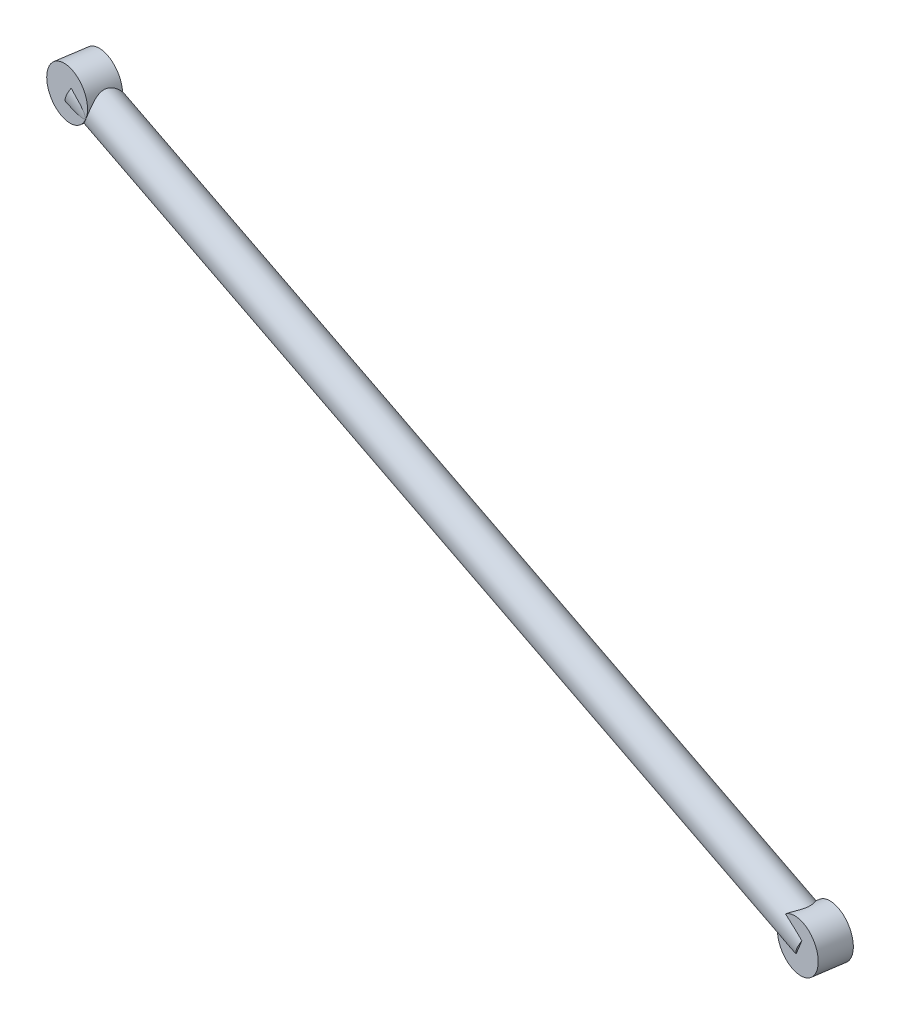
ISO-10303-21;
HEADER;
FILE_DESCRIPTION(('STEP AP214'),'2;1');
FILE_NAME('part.step','',(''),(''),'','','');
FILE_SCHEMA(('AUTOMOTIVE_DESIGN { 1 0 10303 214 1 1 1 1 }'));
ENDSEC;
DATA;
#1=APPLICATION_CONTEXT('core data for automotive mechanical design processes');
#2=APPLICATION_PROTOCOL_DEFINITION('international standard','automotive_design',2000,#1);
#3=PRODUCT_CONTEXT('',#1,'mechanical');
#4=PRODUCT('Part','Part','',(#3));
#5=PRODUCT_RELATED_PRODUCT_CATEGORY('part','',(#4));
#6=PRODUCT_DEFINITION_FORMATION('','',#4);
#7=PRODUCT_DEFINITION_CONTEXT('part definition',#1,'design');
#8=PRODUCT_DEFINITION('design','',#6,#7);
#9=PRODUCT_DEFINITION_SHAPE('','',#8);
#10=(LENGTH_UNIT() NAMED_UNIT(*) SI_UNIT(.MILLI.,.METRE.));
#11=(NAMED_UNIT(*) PLANE_ANGLE_UNIT() SI_UNIT($,.RADIAN.));
#12=(NAMED_UNIT(*) SI_UNIT($,.STERADIAN.) SOLID_ANGLE_UNIT());
#13=UNCERTAINTY_MEASURE_WITH_UNIT(LENGTH_MEASURE(1.E-05),#10,'distance_accuracy_value','');
#14=(GEOMETRIC_REPRESENTATION_CONTEXT(3) GLOBAL_UNCERTAINTY_ASSIGNED_CONTEXT((#13)) GLOBAL_UNIT_ASSIGNED_CONTEXT((#10,
#11,#12)) REPRESENTATION_CONTEXT('',''));
#15=CARTESIAN_POINT('',(0.,0.,0.));
#16=DIRECTION('',(0.,0.,1.));
#17=DIRECTION('',(1.,0.,0.));
#18=AXIS2_PLACEMENT_3D('',#15,#16,#17);
#19=CARTESIAN_POINT('',(-175.,1319.6,-94.));
#20=DIRECTION('',(-0.912250150157576,0.407836306683906,-0.0383302816048973));
#21=DIRECTION('',(-0.408136235908337,-0.912921033243607,0.));
#22=AXIS2_PLACEMENT_3D('',#19,#20,#21);
#23=PLANE('',#22);
#24=DIRECTION('',(-0.405264883425802,-0.9121907599121,-0.060567250167539));
#25=VECTOR('',#24,1.);
#26=CARTESIAN_POINT('',(-175.419638353964,1319.32065466055,-86.9849724910181));
#27=LINE('',#26,#25);
#28=CARTESIAN_POINT('',(-173.874560531103,1322.79839421066,-86.7540590345291));
#29=VERTEX_POINT('',#28);
#30=CARTESIAN_POINT('',(-176.964716176824,1315.84291511045,-87.2158859475072));
#31=VERTEX_POINT('',#30);
#32=EDGE_CURVE('E214',#29,#31,#27,.T.);
#33=ORIENTED_EDGE('',*,*,#32,.F.);
#34=CARTESIAN_POINT('',(-175.,1319.6,-94.));
#35=DIRECTION('',(-0.912250150157576,0.407836306683906,-0.0383302816048973));
#36=DIRECTION('',(-0.408136235908337,-0.912921033243607,0.));
#37=AXIS2_PLACEMENT_3D('',#34,#35,#36);
#38=CIRCLE('',#37,8.00000000000001);
#39=EDGE_CURVE('E121',#31,#29,#38,.T.);
#40=ORIENTED_EDGE('',*,*,#39,.F.);
#41=EDGE_LOOP('',(#33,#40));
#42=FACE_BOUND('',#41,.T.);
#43=ADVANCED_FACE('F61',(#42),#23,.F.);
#44=CARTESIAN_POINT('',(-175.,1319.6,-94.));
#45=DIRECTION('',(-0.912250150157576,0.407836306683905,-0.0383302816048975));
#46=DIRECTION('',(-0.408136235908336,-0.912921033243607,0.));
#47=AXIS2_PLACEMENT_3D('',#44,#45,#46);
#48=CYLINDRICAL_SURFACE('',#47,8.00000000000001);
#49=CARTESIAN_POINT('',(-454.929916770915,1444.74723441423,-105.761897257689));
#50=DIRECTION('',(0.147809429099499,0.,-0.989015860676299));
#51=DIRECTION('',(-0.902171129515433,0.409765808152639,-0.134830395452446));
#52=AXIS2_PLACEMENT_3D('',#49,#50,#51);
#53=ELLIPSE('',#52,82.5338575678715,8.00000000000001);
#54=CARTESIAN_POINT('',(-508.92760737851,1475.03577829605,-113.831907192557));
#55=VERTEX_POINT('',#54);
#56=CARTESIAN_POINT('',(-518.845283823176,1477.95708488955,-115.314114052493));
#57=VERTEX_POINT('',#56);
#58=EDGE_CURVE('E82',#55,#57,#53,.F.);
#59=ORIENTED_EDGE('',*,*,#58,.F.);
#60=CARTESIAN_POINT('',(-513.188387094106,1465.44539915011,-114.468685066726));
#61=CARTESIAN_POINT('',(-513.284215606307,1465.38148107877,-114.395912880529));
#62=CARTESIAN_POINT('',(-513.379969312568,1465.31975148933,-114.321160369834));
#63=CARTESIAN_POINT('',(-513.571010630116,1465.20054398279,-114.16779086904));
#64=CARTESIAN_POINT('',(-513.666298283711,1465.14306567281,-114.089174237157));
#65=CARTESIAN_POINT('',(-513.951052462724,1464.97678027019,-113.847619125337));
#66=CARTESIAN_POINT('',(-514.139371274944,1464.87414840124,-113.679004876877));
#67=CARTESIAN_POINT('',(-514.512077511583,1464.6834506392,-113.325382032472));
#68=CARTESIAN_POINT('',(-514.696402404782,1464.59555004078,-113.140219089599));
#69=CARTESIAN_POINT('',(-515.055944497999,1464.43470311508,-112.755175302953));
#70=CARTESIAN_POINT('',(-515.231164218723,1464.36175263233,-112.555298570024));
#71=CARTESIAN_POINT('',(-515.528515289075,1464.24571192585,-112.190185128124));
#72=CARTESIAN_POINT('',(-515.653333777297,1464.19965084251,-112.028071224825));
#73=CARTESIAN_POINT('',(-515.893689532046,1464.11539998663,-111.69504976594));
#74=CARTESIAN_POINT('',(-516.00922494514,1464.0772117836,-111.524140465407));
#75=CARTESIAN_POINT('',(-516.228316651389,1464.00862880188,-111.174197400632));
#76=CARTESIAN_POINT('',(-516.33191632106,1463.97820528114,-110.995196573874));
#77=CARTESIAN_POINT('',(-516.525062279776,1463.92484143448,-110.628716238182));
#78=CARTESIAN_POINT('',(-516.614614534461,1463.90189792746,-110.44124037223));
#79=CARTESIAN_POINT('',(-516.758935008781,1463.86772008986,-110.100942443538));
#80=CARTESIAN_POINT('',(-516.817011585485,1463.85501700718,-109.949668800854));
#81=CARTESIAN_POINT('',(-516.921759004663,1463.83414132443,-109.642973426285));
#82=CARTESIAN_POINT('',(-516.96843563464,1463.82596642282,-109.487553843842));
#83=CARTESIAN_POINT('',(-517.049296469572,1463.81419922874,-109.173447573947));
#84=CARTESIAN_POINT('',(-517.083490873184,1463.81060318909,-109.014763666125));
#85=CARTESIAN_POINT('',(-517.138672616055,1463.80805912332,-108.695066831906));
#86=CARTESIAN_POINT('',(-517.159659857481,1463.80911113163,-108.534053888265));
#87=CARTESIAN_POINT('',(-517.188120954294,1463.81595848405,-108.210668996741));
#88=CARTESIAN_POINT('',(-517.195572392196,1463.82176167388,-108.048295241007));
#89=CARTESIAN_POINT('',(-517.197062333499,1463.83821438644,-107.723742926205));
#90=CARTESIAN_POINT('',(-517.191100880022,1463.84886389359,-107.561564366509));
#91=CARTESIAN_POINT('',(-517.166379034688,1463.87511820729,-107.238413695151));
#92=CARTESIAN_POINT('',(-517.147603725284,1463.89072877805,-107.077443210957));
#93=CARTESIAN_POINT('',(-517.098205941933,1463.92700542713,-106.757838793334));
#94=CARTESIAN_POINT('',(-517.067576470344,1463.94767448887,-106.599206297569));
#95=CARTESIAN_POINT('',(-516.985670444903,1464.00061605199,-106.241612685622));
#96=CARTESIAN_POINT('',(-516.931024082251,1464.03451681949,-106.043661788237));
#97=CARTESIAN_POINT('',(-516.806916875375,1464.11097267185,-105.654161292006));
#98=CARTESIAN_POINT('',(-516.737450070902,1464.15353123825,-105.462614304537));
#99=CARTESIAN_POINT('',(-516.586134263684,1464.247615516,-105.086524202289));
#100=CARTESIAN_POINT('',(-516.504271612527,1464.29915112101,-104.901989091592));
#101=CARTESIAN_POINT('',(-516.330486249463,1464.41144878248,-104.54067003));
#102=CARTESIAN_POINT('',(-516.23856414249,1464.47221028422,-104.363885613904));
#103=CARTESIAN_POINT('',(-516.044272310111,1464.60489195043,-104.014197024769));
#104=CARTESIAN_POINT('',(-515.941701241295,1464.67704979184,-103.841495202773));
#105=CARTESIAN_POINT('',(-515.729889661392,1464.83176291237,-103.504976357548));
#106=CARTESIAN_POINT('',(-515.620646608379,1464.91432216716,-103.341162766051));
#107=CARTESIAN_POINT('',(-515.397175988386,1465.09015090664,-103.022963086213));
#108=CARTESIAN_POINT('',(-515.282948653722,1465.18341989248,-102.86857655928));
#109=CARTESIAN_POINT('',(-515.051005336409,1465.38096791528,-102.569789444029));
#110=CARTESIAN_POINT('',(-514.93328929424,1465.48524714016,-102.425389026221));
#111=CARTESIAN_POINT('',(-514.673816757727,1465.72537779699,-102.121536100618));
#112=CARTESIAN_POINT('',(-514.53163573525,1465.86350323625,-101.9642294971));
#113=CARTESIAN_POINT('',(-514.246586298299,1466.15578537282,-101.665887338322));
#114=CARTESIAN_POINT('',(-514.103717796108,1466.30994417056,-101.524853920028));
#115=CARTESIAN_POINT('',(-513.819610749535,1466.63413059401,-101.260659654245));
#116=CARTESIAN_POINT('',(-513.678371484734,1466.80415087813,-101.13749060492));
#117=CARTESIAN_POINT('',(-513.399733089623,1467.15962294355,-100.910610403272));
#118=CARTESIAN_POINT('',(-513.262333222813,1467.34507173771,-100.806895497008));
#119=CARTESIAN_POINT('',(-513.007457538217,1467.71057423264,-100.630143130501));
#120=CARTESIAN_POINT('',(-512.889386735631,1467.88921809355,-100.55504674225));
#121=CARTESIAN_POINT('',(-512.659716084986,1468.25704697323,-100.422891302543));
#122=CARTESIAN_POINT('',(-512.548115854032,1468.44623136695,-100.365831182899));
#123=CARTESIAN_POINT('',(-512.332961898018,1468.83348831759,-100.270674387989));
#124=CARTESIAN_POINT('',(-512.229400585659,1469.03155220826,-100.232559643438));
#125=CARTESIAN_POINT('',(-512.031490666457,1469.43493033538,-100.175803793474));
#126=CARTESIAN_POINT('',(-511.937140925115,1469.64024367474,-100.157160287231));
#127=CARTESIAN_POINT('',(-511.771065092662,1470.02715238659,-100.140789140383));
#128=CARTESIAN_POINT('',(-511.698017072297,1470.20807930168,-100.140515162502));
#129=CARTESIAN_POINT('',(-511.559928086673,1470.57241143728,-100.154485389974));
#130=CARTESIAN_POINT('',(-511.494886990289,1470.75581661714,-100.168729357541));
#131=CARTESIAN_POINT('',(-511.373068215277,1471.12369301274,-100.211468599641));
#132=CARTESIAN_POINT('',(-511.316290417062,1471.308164213,-100.239963667906));
#133=CARTESIAN_POINT('',(-511.211047521104,1471.676820357,-100.31077102855));
#134=CARTESIAN_POINT('',(-511.162582757686,1471.86100528893,-100.353083876439));
#135=CARTESIAN_POINT('',(-511.073930236069,1472.22742975323,-100.450872194918));
#136=CARTESIAN_POINT('',(-511.033725577281,1472.40967251967,-100.506320279098));
#137=CARTESIAN_POINT('',(-510.961162752602,1472.77146253857,-100.629796910271));
#138=CARTESIAN_POINT('',(-510.928807191894,1472.95100887755,-100.69782962104));
#139=CARTESIAN_POINT('',(-510.842935488211,1473.4838350479,-100.919757151377));
#140=CARTESIAN_POINT('',(-510.800544231177,1473.83160025075,-101.091562088993));
#141=CARTESIAN_POINT('',(-510.737208236331,1474.54621816025,-101.50138807176));
#142=CARTESIAN_POINT('',(-510.71953561003,1474.91017218083,-101.744949079911));
#143=CARTESIAN_POINT('',(-510.710142882917,1475.42882939972,-102.145972958755));
#144=CARTESIAN_POINT('',(-510.709876047381,1475.59738066856,-102.285809815468));
#145=CARTESIAN_POINT('',(-510.713763553988,1475.92428141629,-102.57685627291));
#146=CARTESIAN_POINT('',(-510.717916665044,1476.08263372286,-102.728062695974));
#147=CARTESIAN_POINT('',(-510.730034917516,1476.40980863138,-103.063737689257));
#148=CARTESIAN_POINT('',(-510.738459066905,1476.57690602365,-103.249875201733));
#149=CARTESIAN_POINT('',(-510.756833177872,1476.8944675556,-103.635892305335));
#150=CARTESIAN_POINT('',(-510.76678356591,1477.04492702602,-103.835775728704));
#151=CARTESIAN_POINT('',(-510.785446734009,1477.32651050548,-104.248180838236));
#152=CARTESIAN_POINT('',(-510.794162219972,1477.4576768143,-104.460673397874));
#153=CARTESIAN_POINT('',(-510.807311163272,1477.69819463725,-104.897752933377));
#154=CARTESIAN_POINT('',(-510.811747557483,1477.80756107236,-105.122331502311));
#155=CARTESIAN_POINT('',(-510.812874951089,1477.96784841007,-105.502629823565));
#156=CARTESIAN_POINT('',(-510.811711190807,1478.02591160208,-105.655354782394));
#157=CARTESIAN_POINT('',(-510.805297289807,1478.13041213384,-105.964631316349));
#158=CARTESIAN_POINT('',(-510.800048438265,1478.17685313523,-106.121181669161));
#159=CARTESIAN_POINT('',(-510.784729494624,1478.25722156708,-106.436973815161));
#160=CARTESIAN_POINT('',(-510.774667296967,1478.29116932717,-106.596210790883));
#161=CARTESIAN_POINT('',(-510.749193773776,1478.3460243815,-106.916509267967));
#162=CARTESIAN_POINT('',(-510.733782369688,1478.36693148423,-107.077570796089));
#163=CARTESIAN_POINT('',(-510.697320633757,1478.39541635289,-107.400735499338));
#164=CARTESIAN_POINT('',(-510.676253350494,1478.4029535221,-107.562840352047));
#165=CARTESIAN_POINT('',(-510.62860774187,1478.40461580282,-107.886296337631));
#166=CARTESIAN_POINT('',(-510.602029502998,1478.39874112482,-108.047647482294));
#167=CARTESIAN_POINT('',(-510.543770021585,1478.37397883237,-108.368527043822));
#168=CARTESIAN_POINT('',(-510.512085032706,1478.35508163094,-108.528054029752));
#169=CARTESIAN_POINT('',(-510.444296138434,1478.30495383166,-108.844262575362));
#170=CARTESIAN_POINT('',(-510.408189938072,1478.27371680955,-109.00094260837));
#171=CARTESIAN_POINT('',(-510.321935549513,1478.18955933853,-109.353466578559));
#172=CARTESIAN_POINT('',(-510.270663162029,1478.13303305025,-109.548176756109));
#173=CARTESIAN_POINT('',(-510.164173092254,1478.0032228523,-109.930832028154));
#174=CARTESIAN_POINT('',(-510.108953665136,1477.92993149956,-110.118774074832));
#175=CARTESIAN_POINT('',(-509.996185324146,1477.76807453547,-110.48824998895));
#176=CARTESIAN_POINT('',(-509.938627294602,1477.67944365181,-110.66975230566));
#177=CARTESIAN_POINT('',(-509.823143403852,1477.48874787494,-111.025333072067));
#178=CARTESIAN_POINT('',(-509.765217612857,1477.3866854767,-111.199412892604));
#179=CARTESIAN_POINT('',(-509.62912200851,1477.1300330242,-111.60388459156));
#180=CARTESIAN_POINT('',(-509.551465625743,1476.97005543746,-111.831044365497));
#181=CARTESIAN_POINT('',(-509.401918580511,1476.62978986892,-112.271687336442));
#182=CARTESIAN_POINT('',(-509.330030127833,1476.44949416594,-112.48516528548));
#183=CARTESIAN_POINT('',(-509.196055243822,1476.07281359108,-112.895770196044));
#184=CARTESIAN_POINT('',(-509.133860975276,1475.87664918153,-113.093063413306));
#185=CARTESIAN_POINT('',(-509.049382410077,1475.57022165066,-113.378304964837));
#186=CARTESIAN_POINT('',(-509.022695773459,1475.46606916607,-113.471586340123));
#187=CARTESIAN_POINT('',(-508.972602652675,1475.25383286638,-113.654506516911));
#188=CARTESIAN_POINT('',(-508.949196498202,1475.1457486575,-113.74414495165));
#189=CARTESIAN_POINT('',(-508.92760737851,1475.03577829605,-113.831907192557));
#190=B_SPLINE_CURVE_WITH_KNOTS('',3,(#60,#61,#62,#63,#64,#65,#66,#67,#68,#69,#70,#71,#72,#73,
#74,#75,#76,#77,#78,#79,#80,#81,#82,#83,#84,#85,#86,#87,#88,#89,#90,#91,#92,#93,#94,#95,#96,#97,
#98,#99,#100,#101,#102,#103,#104,#105,#106,#107,#108,#109,#110,#111,#112,#113,#114,#115,#116,
#117,#118,#119,#120,#121,#122,#123,#124,#125,#126,#127,#128,#129,#130,#131,#132,#133,#134,#135,
#136,#137,#138,#139,#140,#141,#142,#143,#144,#145,#146,#147,#148,#149,#150,#151,#152,#153,#154,
#155,#156,#157,#158,#159,#160,#161,#162,#163,#164,#165,#166,#167,#168,#169,#170,#171,#172,#173,
#174,#175,#176,#177,#178,#179,#180,#181,#182,#183,#184,#185,#186,#187,#188,#189),.UNSPECIFIED.,
.F.,.F.,(4,2,2,2,2,2,2,2,2,2,2,2,2,2,2,2,2,2,2,2,2,2,2,2,2,2,2,2,2,2,2,2,2,2,2,2,2,2,2,2,2,2,2,
2,2,2,2,2,2,2,2,2,2,2,2,2,2,2,2,2,2,2,2,2,4),(0.,0.408682242264147,0.817326669733494,
1.63478049720184,2.46086825513319,3.28672608429604,3.9154127295844,4.54422458639344,
5.17067389800357,5.79685644532708,6.28400064584833,6.77089701742606,7.25739467301158,
7.74389593226014,8.23120218440849,8.7185068698907,9.20637983228154,9.69454123174017,
10.3180211431972,10.9417522700552,11.5661752162143,12.1905606327649,12.8303016713007,
13.4702879805195,14.1102444918358,14.750211927508,15.5083802863279,16.266648093455,
17.0245666573347,17.7823388197515,18.462104159357,19.1418292327186,19.8209047635675,
20.4998965535663,21.084541147031,21.6691761649017,22.2538027210984,22.8384527836683,
23.4218944408864,24.0055294832903,25.1718591096599,26.4813856612196,27.1379421726908,
27.7943158612191,28.5442547071668,29.2944034839997,30.0428822459092,30.7908469372591,
31.2805847842231,31.7701681420373,32.2589512655465,32.7477415672176,33.2380135170272,
33.7282777731724,34.2189033406527,34.7097846711699,35.336229481197,35.9629529507336,
36.5924119223243,37.2217541329401,38.0859859476789,38.9505472979779,39.8046734058599,
40.2315802031329,40.6585298744859),.UNSPECIFIED.);
#191=CARTESIAN_POINT('',(-513.188387094106,1465.44539915011,-114.468685066726));
#192=VERTEX_POINT('',#191);
#193=EDGE_CURVE('E12',#192,#55,#190,.T.);
#194=ORIENTED_EDGE('',*,*,#193,.F.);
#195=CARTESIAN_POINT('',(-521.935439468897,1471.00160578934,-115.775940965471));
#196=VERTEX_POINT('',#195);
#197=EDGE_CURVE('E123',#196,#192,#53,.F.);
#198=ORIENTED_EDGE('',*,*,#197,.F.);
#199=CARTESIAN_POINT('',(-520.81,1474.2,-108.53));
#200=DIRECTION('',(-0.912250150157576,0.407836306683906,-0.0383302816048973));
#201=DIRECTION('',(-0.408136235908337,-0.912921033243607,0.));
#202=AXIS2_PLACEMENT_3D('',#199,#200,#201);
#203=CIRCLE('',#202,8.00000000000001);
#204=EDGE_CURVE('E116',#57,#196,#203,.T.);
#205=ORIENTED_EDGE('',*,*,#204,.F.);
#206=EDGE_LOOP('',(#59,#194,#198,#205));
#207=FACE_BOUND('',#206,.T.);
#208=CARTESIAN_POINT('',(-186.88239262149,1318.76422170395,-88.698092807443));
#209=CARTESIAN_POINT('',(-186.86172760947,1318.65895795582,-88.7820982554029));
#210=CARTESIAN_POINT('',(-186.839397542882,1318.55542189208,-88.8678240039344));
#211=CARTESIAN_POINT('',(-186.791717181888,1318.35194528448,-89.0426189459024));
#212=CARTESIAN_POINT('',(-186.76636716713,1318.25200440883,-89.1316878292408));
#213=CARTESIAN_POINT('',(-186.686234914089,1317.95771639938,-89.4038238965958));
#214=CARTESIAN_POINT('',(-186.627379057128,1317.76894648059,-89.5917865157624));
#215=CARTESIAN_POINT('',(-186.500733060272,1317.40579937156,-89.9821833139655));
#216=CARTESIAN_POINT('',(-186.432855122353,1317.23159525533,-90.1847493730721));
#217=CARTESIAN_POINT('',(-186.291436170281,1316.9014795489,-90.6023918856319));
#218=CARTESIAN_POINT('',(-186.217896737616,1316.74556288075,-90.8174648413173));
#219=CARTESIAN_POINT('',(-186.086090933412,1316.48898590357,-91.2073191920871));
#220=CARTESIAN_POINT('',(-186.028369924087,1316.38402057736,-91.3794608820408));
#221=CARTESIAN_POINT('',(-185.912909029511,1316.18715174568,-91.7311480051624));
#222=CARTESIAN_POINT('',(-185.855169142789,1316.0952508458,-91.9106949060586));
#223=CARTESIAN_POINT('',(-185.741572625556,1315.926379904,-92.2764043344297));
#224=CARTESIAN_POINT('',(-185.685709734423,1315.84935506178,-92.4625394714276));
#225=CARTESIAN_POINT('',(-185.57747209892,1315.7116029469,-92.8417094426237));
#226=CARTESIAN_POINT('',(-185.525095879305,1315.65086874814,-93.0347413049336));
#227=CARTESIAN_POINT('',(-185.436745580047,1315.55906607617,-93.3834040333743));
#228=CARTESIAN_POINT('',(-185.399711817614,1315.52440492492,-93.5378225461127));
#229=CARTESIAN_POINT('',(-185.329750196278,1315.4669829691,-93.8497166936487));
#230=CARTESIAN_POINT('',(-185.296820258128,1315.44421611934,-94.0071907332052));
#231=CARTESIAN_POINT('',(-185.235800729498,1315.41132349458,-94.3242623065639));
#232=CARTESIAN_POINT('',(-185.207707197373,1315.40118738317,-94.4838579958519));
#233=CARTESIAN_POINT('',(-185.156838070827,1315.39402439333,-94.8041993549798));
#234=CARTESIAN_POINT('',(-185.134062515799,1315.396997612,-94.9649450333293));
#235=CARTESIAN_POINT('',(-185.094012187055,1315.41623589077,-95.2865979023208));
#236=CARTESIAN_POINT('',(-185.076746577603,1315.43252293616,-95.4475049201063));
#237=CARTESIAN_POINT('',(-185.047648831173,1315.47821127201,-95.7679312202748));
#238=CARTESIAN_POINT('',(-185.035816676726,1315.5076125203,-95.9274505071178));
#239=CARTESIAN_POINT('',(-185.017142607838,1315.57903593194,-96.2441156148345));
#240=CARTESIAN_POINT('',(-185.010306528923,1315.62107277334,-96.4012584509228));
#241=CARTESIAN_POINT('',(-185.000966864054,1315.71700535265,-96.712084497002));
#242=CARTESIAN_POINT('',(-184.998465841918,1315.77090808699,-96.8657656066887));
#243=CARTESIAN_POINT('',(-184.996769853746,1315.90614217749,-97.2108648124338));
#244=CARTESIAN_POINT('',(-184.998683506258,1315.99093486926,-97.400934752505));
#245=CARTESIAN_POINT('',(-185.00637465602,1316.17651418439,-97.7730367502648));
#246=CARTESIAN_POINT('',(-185.012153709797,1316.27730723832,-97.9550655384352));
#247=CARTESIAN_POINT('',(-185.025740623204,1316.49323014216,-98.3105719170306));
#248=CARTESIAN_POINT('',(-185.033550725999,1316.60837576991,-98.4840397988465));
#249=CARTESIAN_POINT('',(-185.049485339115,1316.85137658466,-98.8217679048632));
#250=CARTESIAN_POINT('',(-185.057609830512,1316.97923100736,-98.9860286818441));
#251=CARTESIAN_POINT('',(-185.072814849116,1317.24964702721,-99.3089525640053));
#252=CARTESIAN_POINT('',(-185.079864788036,1317.39249299104,-99.4673786557136));
#253=CARTESIAN_POINT('',(-185.091192077072,1317.68904008356,-99.7739349191901));
#254=CARTESIAN_POINT('',(-185.095468363168,1317.84274535302,-99.9220611203129));
#255=CARTESIAN_POINT('',(-185.099912259113,1318.15991307591,-100.207527032851));
#256=CARTESIAN_POINT('',(-185.100080060255,1318.32337507471,-100.344867246167));
#257=CARTESIAN_POINT('',(-185.095108220555,1318.65908770672,-100.608247149567));
#258=CARTESIAN_POINT('',(-185.089968489114,1318.83133848992,-100.734286646706));
#259=CARTESIAN_POINT('',(-185.071750601691,1319.21624752735,-100.996638455228));
#260=CARTESIAN_POINT('',(-185.057381565984,1319.4304929013,-101.130548492881));
#261=CARTESIAN_POINT('',(-185.018051028577,1319.86834166778,-101.380411733649));
#262=CARTESIAN_POINT('',(-184.993088137719,1320.0919462841,-101.496362579077));
#263=CARTESIAN_POINT('',(-184.931212456725,1320.5465153366,-101.708849373348));
#264=CARTESIAN_POINT('',(-184.894305175773,1320.77747633556,-101.805394239714));
#265=CARTESIAN_POINT('',(-184.807457705149,1321.24465839893,-101.977652205961));
#266=CARTESIAN_POINT('',(-184.757520034324,1321.48087843868,-102.053369326155));
#267=CARTESIAN_POINT('',(-184.649760188196,1321.93161439388,-102.175925442734));
#268=CARTESIAN_POINT('',(-184.59327885759,1322.1458613299,-102.224934836649));
#269=CARTESIAN_POINT('',(-184.469062610244,1322.57457903397,-102.304201518514));
#270=CARTESIAN_POINT('',(-184.401328360314,1322.78904978799,-102.334459917082));
#271=CARTESIAN_POINT('',(-184.254815877377,1323.21585000656,-102.375565293819));
#272=CARTESIAN_POINT('',(-184.176048259809,1323.42818132147,-102.38643079383));
#273=CARTESIAN_POINT('',(-184.007921893627,1323.8486962356,-102.388482147614));
#274=CARTESIAN_POINT('',(-183.918564452267,1324.05688034308,-102.379670428035));
#275=CARTESIAN_POINT('',(-183.743220174416,1324.43845733676,-102.345015991175));
#276=CARTESIAN_POINT('',(-183.658490266348,1324.61266498754,-102.321709896731));
#277=CARTESIAN_POINT('',(-183.482533912473,1324.95520203454,-102.260805272968));
#278=CARTESIAN_POINT('',(-183.391307573093,1325.123531527,-102.223206977745));
#279=CARTESIAN_POINT('',(-183.203217274847,1325.45321419611,-102.134151508562));
#280=CARTESIAN_POINT('',(-183.106353397595,1325.61456747369,-102.082694535196));
#281=CARTESIAN_POINT('',(-182.907933447304,1325.92941106975,-101.966504452467));
#282=CARTESIAN_POINT('',(-182.806377185761,1326.08290107182,-101.901770809388));
#283=CARTESIAN_POINT('',(-182.599791001874,1326.38101486421,-101.75985876525));
#284=CARTESIAN_POINT('',(-182.494768693044,1326.52565632428,-101.682706362638));
#285=CARTESIAN_POINT('',(-182.282065536339,1326.80595744867,-101.516596439598));
#286=CARTESIAN_POINT('',(-182.174383818815,1326.94161412005,-101.42763501477));
#287=CARTESIAN_POINT('',(-181.848994052145,1327.33447613169,-101.144244038233));
#288=CARTESIAN_POINT('',(-181.628771930294,1327.57781444519,-100.933191263297));
#289=CARTESIAN_POINT('',(-181.163064061793,1328.05399530329,-100.444299135568));
#290=CARTESIAN_POINT('',(-180.917796155837,1328.28188117248,-100.161441396691));
#291=CARTESIAN_POINT('',(-180.560317212827,1328.58899732119,-99.7055881725657));
#292=CARTESIAN_POINT('',(-180.442741518509,1328.68569199705,-99.5481396295764));
#293=CARTESIAN_POINT('',(-180.212722295674,1328.86777998855,-99.2232975565063));
#294=CARTESIAN_POINT('',(-180.100277347183,1328.95317644363,-99.0559068078879));
#295=CARTESIAN_POINT('',(-179.866719189222,1329.1244297087,-98.6871373948782));
#296=CARTESIAN_POINT('',(-179.746655224511,1329.20861687658,-98.4843151981378));
#297=CARTESIAN_POINT('',(-179.51847522506,1329.36329708251,-98.0669423905155));
#298=CARTESIAN_POINT('',(-179.41036254432,1329.43378628057,-97.8523885123842));
#299=CARTESIAN_POINT('',(-179.209884517795,1329.56144090846,-97.4128109868237));
#300=CARTESIAN_POINT('',(-179.11748465041,1329.61863565091,-97.1878117110301));
#301=CARTESIAN_POINT('',(-178.952283058268,1329.72036564406,-96.7280077520754));
#302=CARTESIAN_POINT('',(-178.879467916693,1329.76490956257,-96.4932099096063));
#303=CARTESIAN_POINT('',(-178.778870598429,1329.82851417768,-96.0980457066607));
#304=CARTESIAN_POINT('',(-178.744220122146,1329.8510634863,-95.9399682736495));
#305=CARTESIAN_POINT('',(-178.686446777511,1329.89103886342,-95.6210988903678));
#306=CARTESIAN_POINT('',(-178.663320276192,1329.90846654582,-95.4603078121296));
#307=CARTESIAN_POINT('',(-178.629688969442,1329.93827782094,-95.1372000012836));
#308=CARTESIAN_POINT('',(-178.61916359537,1329.95066961177,-94.9748861919691));
#309=CARTESIAN_POINT('',(-178.611436036052,1329.97054523834,-94.6496257792418));
#310=CARTESIAN_POINT('',(-178.614234046471,1329.97802900199,-94.486679166571));
#311=CARTESIAN_POINT('',(-178.633523009023,1329.98819748288,-94.1609479748259));
#312=CARTESIAN_POINT('',(-178.650055442248,1329.99086758421,-93.9981653841529));
#313=CARTESIAN_POINT('',(-178.696700395505,1329.99145762935,-93.6745598496034));
#314=CARTESIAN_POINT('',(-178.726812702424,1329.9893776477,-93.5137368750148));
#315=CARTESIAN_POINT('',(-178.799995824143,1329.98054905343,-93.1950876667518));
#316=CARTESIAN_POINT('',(-178.843076172653,1329.97379700128,-93.0372637289409));
#317=CARTESIAN_POINT('',(-178.941183369783,1329.95568282634,-92.7255862846153));
#318=CARTESIAN_POINT('',(-178.996216434406,1329.94431830216,-92.571734890775));
#319=CARTESIAN_POINT('',(-179.133666476908,1329.91324199798,-92.2268621632837));
#320=CARTESIAN_POINT('',(-179.219448725236,1329.89209174068,-92.0373095196345));
#321=CARTESIAN_POINT('',(-179.405720338224,1329.84232559362,-91.6665776805933));
#322=CARTESIAN_POINT('',(-179.506216228031,1329.81370638712,-91.4854022474434));
#323=CARTESIAN_POINT('',(-179.719750860531,1329.74875347011,-91.1309859583654));
#324=CARTESIAN_POINT('',(-179.832842435291,1329.71238663281,-90.957783186628));
#325=CARTESIAN_POINT('',(-180.068840681464,1329.63182258445,-90.6202134135538));
#326=CARTESIAN_POINT('',(-180.191745528342,1329.58762682712,-90.4558447791926));
#327=CARTESIAN_POINT('',(-180.492750680181,1329.47309250378,-90.0760189803045));
#328=CARTESIAN_POINT('',(-180.674330850759,1329.39915315655,-89.8643907224502));
#329=CARTESIAN_POINT('',(-181.047964634893,1329.23503292457,-89.4572377431859));
#330=CARTESIAN_POINT('',(-181.240022215619,1329.14484585761,-89.2617191928976));
#331=CARTESIAN_POINT('',(-181.62864807282,1328.9483451028,-88.8891721300019));
#332=CARTESIAN_POINT('',(-181.825133925446,1328.84223920189,-88.7119489269486));
#333=CARTESIAN_POINT('',(-182.122425561328,1328.66965627663,-88.4585125058845));
#334=CARTESIAN_POINT('',(-182.221931467791,1328.60990345431,-88.3761140447464));
#335=CARTESIAN_POINT('',(-182.421468430405,1328.48576397308,-88.2155284025409));
#336=CARTESIAN_POINT('',(-182.521499538292,1328.4213768494,-88.1373416452417));
#337=CARTESIAN_POINT('',(-182.621612905894,1328.35460084989,-88.0613149332738));
#338=B_SPLINE_CURVE_WITH_KNOTS('',3,(#208,#209,#210,#211,#212,#213,#214,#215,#216,#217,#218,
#219,#220,#221,#222,#223,#224,#225,#226,#227,#228,#229,#230,#231,#232,#233,#234,#235,#236,#237,
#238,#239,#240,#241,#242,#243,#244,#245,#246,#247,#248,#249,#250,#251,#252,#253,#254,#255,#256,
#257,#258,#259,#260,#261,#262,#263,#264,#265,#266,#267,#268,#269,#270,#271,#272,#273,#274,#275,
#276,#277,#278,#279,#280,#281,#282,#283,#284,#285,#286,#287,#288,#289,#290,#291,#292,#293,#294,
#295,#296,#297,#298,#299,#300,#301,#302,#303,#304,#305,#306,#307,#308,#309,#310,#311,#312,#313,
#314,#315,#316,#317,#318,#319,#320,#321,#322,#323,#324,#325,#326,#327,#328,#329,#330,#331,#332,
#333,#334,#335,#336,#337),.UNSPECIFIED.,.F.,.F.,(4,2,2,2,2,2,2,2,2,2,2,2,2,2,2,2,2,2,2,2,2,2,2,
2,2,2,2,2,2,2,2,2,2,2,2,2,2,2,2,2,2,2,2,2,2,2,2,2,2,2,2,2,2,2,2,2,2,2,2,2,2,2,2,2,4),(0.,
0.408682242264014,0.817326669733481,1.63478049720207,2.46086825513353,3.28672608429653,
3.91541272958501,4.54422458639389,5.17067389800392,5.79685644532736,6.28400064584858,
6.77089701742637,7.25739467301185,7.74389593226037,8.23120218440867,8.71850686989084,
9.20637983228164,9.69454123174031,10.3180211431972,10.9417522700552,11.5661752162145,
12.1905606327649,12.8303016713007,13.4702879805194,14.1102444918357,14.7502119275081,
15.508380286328,16.2666480934548,17.0245666573345,17.7823388197515,18.4621041593568,
19.1418292327186,19.8209047635678,20.4998965535664,21.0845411470314,21.6691761649019,
22.2538027210983,22.8384527836685,23.4218944408865,24.0055294832902,25.1718591096601,
26.48138566122,27.1379421726911,27.7943158612194,28.5442547071669,29.2944034839999,
30.0428822459094,30.7908469372594,31.2805847842234,31.7701681420376,32.2589512655468,
32.7477415672179,33.2380135170275,33.7282777731728,34.218903340653,34.7097846711701,
35.3362294811972,35.9629529507339,36.5924119223247,37.2217541329406,38.0859859476795,
38.9505472979782,39.8046734058602,40.2315802031329,40.658529874486),.UNSPECIFIED.);
#339=CARTESIAN_POINT('',(-186.88239262149,1318.76422170395,-88.698092807443));
#340=VERTEX_POINT('',#339);
#341=CARTESIAN_POINT('',(-182.621612905894,1328.35460084989,-88.0613149332738));
#342=VERTEX_POINT('',#341);
#343=EDGE_CURVE('E141',#340,#342,#338,.T.);
#344=ORIENTED_EDGE('',*,*,#343,.F.);
#345=CARTESIAN_POINT('',(-240.880083229081,1349.05276558577,-96.7681027423109));
#346=DIRECTION('',(0.147809429099505,0.,-0.989015860676298));
#347=DIRECTION('',(-0.902171129515432,0.409765808152639,-0.134830395452451));
#348=AXIS2_PLACEMENT_3D('',#345,#346,#347);
#349=ELLIPSE('',#348,82.533857567867,8.00000000000001);
#350=EDGE_CURVE('E136',#340,#31,#349,.F.);
#351=ORIENTED_EDGE('',*,*,#350,.T.);
#352=ORIENTED_EDGE('',*,*,#39,.T.);
#353=EDGE_CURVE('E139',#29,#342,#349,.F.);
#354=ORIENTED_EDGE('',*,*,#353,.T.);
#355=EDGE_LOOP('',(#344,#351,#352,#354));
#356=FACE_BOUND('',#355,.T.);
#357=ADVANCED_FACE('F124',(#207,#356),#48,.T.);
#358=CARTESIAN_POINT('',(-520.81,1474.2,-108.53));
#359=DIRECTION('',(-0.912250150157576,0.407836306683906,-0.0383302816048973));
#360=DIRECTION('',(-0.408136235908337,-0.912921033243607,0.));
#361=AXIS2_PLACEMENT_3D('',#358,#359,#360);
#362=PLANE('',#361);
#363=DIRECTION('',(-0.405264883425802,-0.9121907599121,-0.0605672501675366));
#364=VECTOR('',#363,1.);
#365=CARTESIAN_POINT('',(-520.390361646036,1474.47934533945,-115.545027508982));
#366=LINE('',#365,#364);
#367=EDGE_CURVE('E119',#57,#196,#366,.T.);
#368=ORIENTED_EDGE('',*,*,#367,.F.);
#369=ORIENTED_EDGE('',*,*,#204,.T.);
#370=EDGE_LOOP('',(#368,#369));
#371=FACE_BOUND('',#370,.T.);
#372=ADVANCED_FACE('F117',(#371),#362,.T.);
#373=CARTESIAN_POINT('',(-173.965334,1319.6,-100.923111));
#374=DIRECTION('',(0.147809429099505,0.,-0.989015860676298));
#375=DIRECTION('',(-0.989015860676298,0.,-0.147809429099505));
#376=AXIS2_PLACEMENT_3D('',#373,#374,#375);
#377=PLANE('',#376);
#378=CARTESIAN_POINT('',(-173.965334,1319.6,-100.923111));
#379=DIRECTION('',(0.147809429099505,0.,-0.989015860676298));
#380=DIRECTION('',(-0.989015860676298,0.,-0.147809429099505));
#381=AXIS2_PLACEMENT_3D('',#378,#379,#380);
#382=CIRCLE('',#381,11.);
#383=CARTESIAN_POINT('',(-184.844508467439,1319.6,-102.549014720095));
#384=VERTEX_POINT('',#383);
#385=EDGE_CURVE('E208',#384,#384,#382,.T.);
#386=ORIENTED_EDGE('',*,*,#385,.T.);
#387=EDGE_LOOP('',(#386));
#388=FACE_BOUND('',#387,.T.);
#389=DIRECTION('',(-0.405264883425802,-0.9121907599121,-0.060567250167539));
#390=VECTOR('',#389,1.);
#391=CARTESIAN_POINT('',(-174.580361646037,1319.87934533945,-101.015027508982));
#392=LINE('',#391,#390);
#393=CARTESIAN_POINT('',(-173.035283823176,1323.35708488955,-100.784114052493));
#394=VERTEX_POINT('',#393);
#395=CARTESIAN_POINT('',(-176.125439468897,1316.40160578934,-101.245940965471));
#396=VERTEX_POINT('',#395);
#397=EDGE_CURVE('E211',#394,#396,#392,.T.);
#398=ORIENTED_EDGE('',*,*,#397,.F.);
#399=CARTESIAN_POINT('',(-109.119916770919,1290.14723441423,-91.2318972576891));
#400=DIRECTION('',(0.147809429099505,0.,-0.989015860676298));
#401=DIRECTION('',(-0.902171129515432,0.409765808152639,-0.134830395452451));
#402=AXIS2_PLACEMENT_3D('',#399,#400,#401);
#403=ELLIPSE('',#402,82.533857567867,8.00000000000001);
#404=EDGE_CURVE('E132',#394,#396,#403,.F.);
#405=ORIENTED_EDGE('',*,*,#404,.T.);
#406=EDGE_LOOP('',(#398,#405));
#407=FACE_BOUND('',#406,.T.);
#408=ADVANCED_FACE('F159',(#388,#407),#377,.T.);
#409=CARTESIAN_POINT('',(-176.034666,1319.6,-87.076889));
#410=DIRECTION('',(0.147809429099505,0.,-0.989015860676298));
#411=DIRECTION('',(-0.989015860676298,0.,-0.147809429099505));
#412=AXIS2_PLACEMENT_3D('',#409,#410,#411);
#413=PLANE('',#412);
#414=ORIENTED_EDGE('',*,*,#350,.F.);
#415=CARTESIAN_POINT('',(-176.034666,1319.6,-87.076889));
#416=DIRECTION('',(0.147809429099505,0.,-0.989015860676298));
#417=DIRECTION('',(-0.989015860676298,0.,-0.147809429099505));
#418=AXIS2_PLACEMENT_3D('',#415,#416,#417);
#419=CIRCLE('',#418,11.);
#420=EDGE_CURVE('E205',#342,#340,#419,.T.);
#421=ORIENTED_EDGE('',*,*,#420,.F.);
#422=ORIENTED_EDGE('',*,*,#353,.F.);
#423=ORIENTED_EDGE('',*,*,#32,.T.);
#424=EDGE_LOOP('',(#414,#421,#422,#423));
#425=FACE_BOUND('',#424,.T.);
#426=ADVANCED_FACE('F157',(#425),#413,.F.);
#427=CARTESIAN_POINT('',(-176.034666,1319.6,-87.076889));
#428=DIRECTION('',(0.147809429099506,0.,-0.989015860676298));
#429=DIRECTION('',(-0.989015860676298,0.,-0.147809429099506));
#430=AXIS2_PLACEMENT_3D('',#427,#428,#429);
#431=CYLINDRICAL_SURFACE('',#430,11.);
#432=ORIENTED_EDGE('',*,*,#385,.F.);
#433=EDGE_LOOP('',(#432));
#434=FACE_BOUND('',#433,.T.);
#435=ORIENTED_EDGE('',*,*,#420,.T.);
#436=ORIENTED_EDGE('',*,*,#343,.T.);
#437=EDGE_LOOP('',(#435,#436));
#438=FACE_BOUND('',#437,.T.);
#439=ADVANCED_FACE('F152',(#434,#438),#431,.T.);
#440=ORIENTED_EDGE('',*,*,#404,.F.);
#441=EDGE_CURVE('E216',#394,#396,#38,.T.);
#442=ORIENTED_EDGE('',*,*,#441,.T.);
#443=EDGE_LOOP('',(#440,#442));
#444=FACE_BOUND('',#443,.T.);
#445=ADVANCED_FACE('F149',(#444),#48,.T.);
#446=ORIENTED_EDGE('',*,*,#441,.F.);
#447=ORIENTED_EDGE('',*,*,#397,.T.);
#448=EDGE_LOOP('',(#446,#447));
#449=FACE_BOUND('',#448,.T.);
#450=ADVANCED_FACE('F63',(#449),#23,.F.);
#451=CARTESIAN_POINT('',(-521.844666,1474.2,-101.606889));
#452=DIRECTION('',(0.147809429099499,0.,-0.989015860676299));
#453=DIRECTION('',(-0.989015860676299,0.,-0.147809429099499));
#454=AXIS2_PLACEMENT_3D('',#451,#452,#453);
#455=PLANE('',#454);
#456=CARTESIAN_POINT('',(-586.690083229084,1503.65276558577,-111.298102742311));
#457=DIRECTION('',(0.147809429099499,0.,-0.989015860676299));
#458=DIRECTION('',(-0.902171129515433,0.409765808152639,-0.134830395452446));
#459=AXIS2_PLACEMENT_3D('',#456,#457,#458);
#460=ELLIPSE('',#459,82.5338575678715,8.00000000000001);
#461=CARTESIAN_POINT('',(-522.774716176824,1470.44291511045,-101.745885947507));
#462=VERTEX_POINT('',#461);
#463=CARTESIAN_POINT('',(-519.684560531103,1477.39839421066,-101.284059034529));
#464=VERTEX_POINT('',#463);
#465=EDGE_CURVE('E202',#462,#464,#460,.F.);
#466=ORIENTED_EDGE('',*,*,#465,.F.);
#467=DIRECTION('',(-0.405264883425802,-0.9121907599121,-0.0605672501675366));
#468=VECTOR('',#467,1.);
#469=CARTESIAN_POINT('',(-521.229638353964,1473.92065466055,-101.514972491018));
#470=LINE('',#469,#468);
#471=EDGE_CURVE('E75',#464,#462,#470,.T.);
#472=ORIENTED_EDGE('',*,*,#471,.F.);
#473=EDGE_LOOP('',(#466,#472));
#474=FACE_BOUND('',#473,.T.);
#475=CARTESIAN_POINT('',(-521.844666,1474.2,-101.606889));
#476=DIRECTION('',(0.147809429099499,0.,-0.989015860676299));
#477=DIRECTION('',(-0.989015860676299,0.,-0.147809429099499));
#478=AXIS2_PLACEMENT_3D('',#475,#476,#477);
#479=CIRCLE('',#478,11.);
#480=CARTESIAN_POINT('',(-532.723840467439,1474.2,-103.232792720095));
#481=VERTEX_POINT('',#480);
#482=EDGE_CURVE('E197',#481,#481,#479,.T.);
#483=ORIENTED_EDGE('',*,*,#482,.F.);
#484=EDGE_LOOP('',(#483));
#485=FACE_BOUND('',#484,.T.);
#486=ADVANCED_FACE('F160',(#474,#485),#455,.F.);
#487=CARTESIAN_POINT('',(-519.775334,1474.2,-115.453111));
#488=DIRECTION('',(0.147809429099499,0.,-0.989015860676299));
#489=DIRECTION('',(-0.989015860676299,0.,-0.147809429099499));
#490=AXIS2_PLACEMENT_3D('',#487,#488,#489);
#491=PLANE('',#490);
#492=CARTESIAN_POINT('',(-519.775334,1474.2,-115.453111));
#493=DIRECTION('',(0.147809429099499,0.,-0.989015860676299));
#494=DIRECTION('',(-0.989015860676299,0.,-0.147809429099499));
#495=AXIS2_PLACEMENT_3D('',#492,#493,#494);
#496=CIRCLE('',#495,11.);
#497=EDGE_CURVE('E129',#192,#55,#496,.T.);
#498=ORIENTED_EDGE('',*,*,#497,.T.);
#499=ORIENTED_EDGE('',*,*,#58,.T.);
#500=ORIENTED_EDGE('',*,*,#367,.T.);
#501=ORIENTED_EDGE('',*,*,#197,.T.);
#502=EDGE_LOOP('',(#498,#499,#500,#501));
#503=FACE_BOUND('',#502,.T.);
#504=ADVANCED_FACE('F131',(#503),#491,.T.);
#505=CARTESIAN_POINT('',(-521.844666,1474.2,-101.606889));
#506=DIRECTION('',(0.147809429099507,0.,-0.989015860676298));
#507=DIRECTION('',(-0.989015860676298,0.,-0.147809429099507));
#508=AXIS2_PLACEMENT_3D('',#505,#506,#507);
#509=CYLINDRICAL_SURFACE('',#508,11.);
#510=ORIENTED_EDGE('',*,*,#497,.F.);
#511=ORIENTED_EDGE('',*,*,#193,.T.);
#512=EDGE_LOOP('',(#510,#511));
#513=FACE_BOUND('',#512,.T.);
#514=ORIENTED_EDGE('',*,*,#482,.T.);
#515=EDGE_LOOP('',(#514));
#516=FACE_BOUND('',#515,.T.);
#517=ADVANCED_FACE('F179',(#513,#516),#509,.T.);
#518=EDGE_CURVE('E120',#462,#464,#203,.T.);
#519=ORIENTED_EDGE('',*,*,#518,.T.);
#520=ORIENTED_EDGE('',*,*,#471,.T.);
#521=EDGE_LOOP('',(#519,#520));
#522=FACE_BOUND('',#521,.T.);
#523=ADVANCED_FACE('F184',(#522),#362,.T.);
#524=ORIENTED_EDGE('',*,*,#518,.F.);
#525=ORIENTED_EDGE('',*,*,#465,.T.);
#526=EDGE_LOOP('',(#524,#525));
#527=FACE_BOUND('',#526,.T.);
#528=ADVANCED_FACE('F171',(#527),#48,.T.);
#529=CLOSED_SHELL('',(#43,#357,#372,#408,#426,#439,#445,#450,#486,#504,#517,#523,#528));
#530=MANIFOLD_SOLID_BREP('B2',#529);
#531=ADVANCED_BREP_SHAPE_REPRESENTATION('',(#18,#530),#14);
#532=SHAPE_DEFINITION_REPRESENTATION(#9,#531);
ENDSEC;
END-ISO-10303-21;
